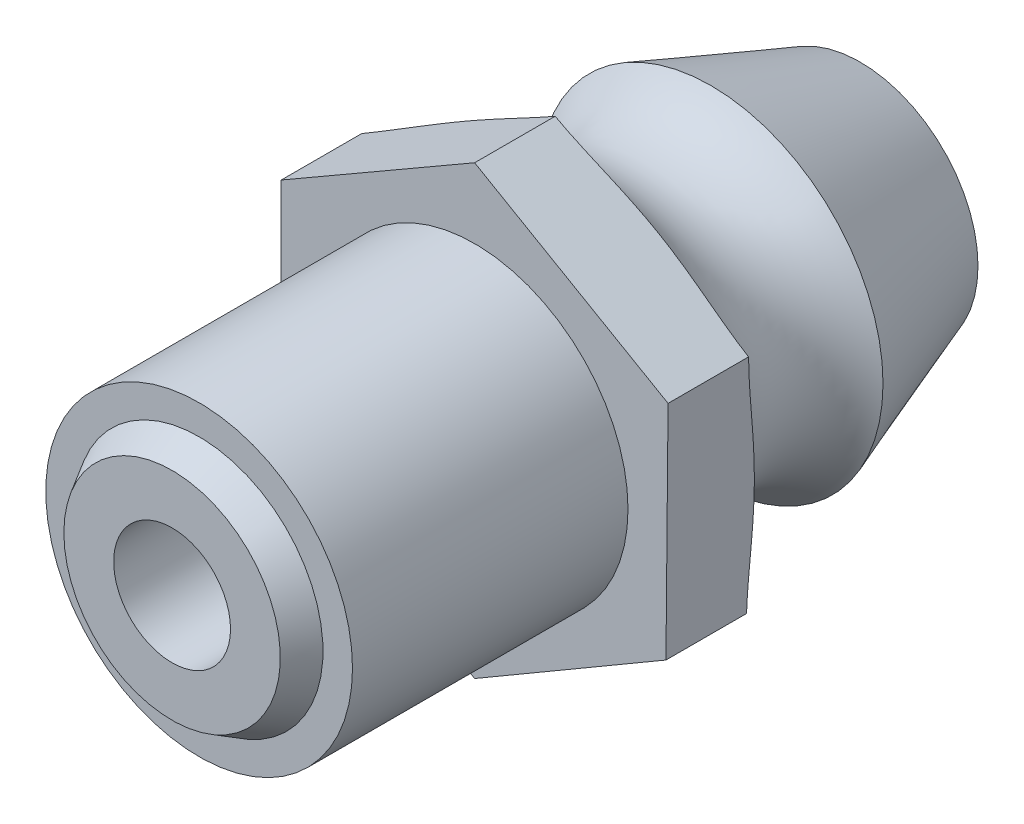
ISO-10303-21;
HEADER;
FILE_DESCRIPTION(('STEP AP214'),'2;1');
FILE_NAME('part.step','',(''),(''),'','','');
FILE_SCHEMA(('AUTOMOTIVE_DESIGN { 1 0 10303 214 1 1 1 1 }'));
ENDSEC;
DATA;
#1=APPLICATION_CONTEXT('core data for automotive mechanical design processes');
#2=APPLICATION_PROTOCOL_DEFINITION('international standard','automotive_design',2000,#1);
#3=PRODUCT_CONTEXT('',#1,'mechanical');
#4=PRODUCT('Part','Part','',(#3));
#5=PRODUCT_RELATED_PRODUCT_CATEGORY('part','',(#4));
#6=PRODUCT_DEFINITION_FORMATION('','',#4);
#7=PRODUCT_DEFINITION_CONTEXT('part definition',#1,'design');
#8=PRODUCT_DEFINITION('design','',#6,#7);
#9=PRODUCT_DEFINITION_SHAPE('','',#8);
#10=(LENGTH_UNIT() NAMED_UNIT(*) SI_UNIT(.MILLI.,.METRE.));
#11=(NAMED_UNIT(*) PLANE_ANGLE_UNIT() SI_UNIT($,.RADIAN.));
#12=(NAMED_UNIT(*) SI_UNIT($,.STERADIAN.) SOLID_ANGLE_UNIT());
#13=UNCERTAINTY_MEASURE_WITH_UNIT(LENGTH_MEASURE(1.E-05),#10,'distance_accuracy_value','');
#14=(GEOMETRIC_REPRESENTATION_CONTEXT(3) GLOBAL_UNCERTAINTY_ASSIGNED_CONTEXT((#13)) GLOBAL_UNIT_ASSIGNED_CONTEXT((#10,
#11,#12)) REPRESENTATION_CONTEXT('',''));
#15=CARTESIAN_POINT('',(0.,0.,0.));
#16=DIRECTION('',(0.,0.,1.));
#17=DIRECTION('',(1.,0.,0.));
#18=AXIS2_PLACEMENT_3D('',#15,#16,#17);
#19=CARTESIAN_POINT('',(-2.22044604925031E-13,0.761999999999485,-7.54380000000054));
#20=DIRECTION('',(0.,0.,1.));
#21=DIRECTION('',(1.,0.,0.));
#22=AXIS2_PLACEMENT_3D('',#19,#20,#21);
#23=PLANE('',#22);
#24=CARTESIAN_POINT('',(-2.22044604925031E-13,-6.66133814775094E-13,-7.54380000000032));
#25=DIRECTION('',(0.,0.,1.));
#26=DIRECTION('',(1.,0.,0.));
#27=AXIS2_PLACEMENT_3D('',#24,#25,#26);
#28=CIRCLE('',#27,0.762);
#29=CARTESIAN_POINT('',(0.761999999999779,-6.6621841376957E-13,-7.54380000000032));
#30=VERTEX_POINT('',#29);
#31=EDGE_CURVE('E20',#30,#30,#28,.T.);
#32=ORIENTED_EDGE('',*,*,#31,.T.);
#33=EDGE_LOOP('',(#32));
#34=FACE_BOUND('',#33,.T.);
#35=CARTESIAN_POINT('',(0.,-4.44089209850063E-13,-7.54380000006494));
#36=DIRECTION('',(0.,0.,1.));
#37=DIRECTION('',(1.,0.,0.));
#38=AXIS2_PLACEMENT_3D('',#35,#36,#37);
#39=CIRCLE('',#38,2.30234294568799);
#40=CARTESIAN_POINT('',(2.302342945688,-4.44344821264951E-13,-7.54380000006494));
#41=VERTEX_POINT('',#40);
#42=EDGE_CURVE('E264',#41,#41,#39,.T.);
#43=ORIENTED_EDGE('',*,*,#42,.F.);
#44=EDGE_LOOP('',(#43));
#45=FACE_BOUND('',#44,.T.);
#46=ADVANCED_FACE('F17',(#34,#45),#23,.F.);
#47=CARTESIAN_POINT('',(6.66133814775094E-13,-6.66133814775094E-13,82.9089130434784));
#48=DIRECTION('',(0.,0.,1.));
#49=DIRECTION('',(1.,0.,0.));
#50=AXIS2_PLACEMENT_3D('',#47,#48,#49);
#51=CYLINDRICAL_SURFACE('',#50,0.762);
#52=ORIENTED_EDGE('',*,*,#31,.F.);
#53=EDGE_LOOP('',(#52));
#54=FACE_BOUND('',#53,.T.);
#55=CARTESIAN_POINT('',(-2.22044604925031E-13,-4.44089209850063E-13,-4.62279999999982));
#56=DIRECTION('',(0.,0.,1.));
#57=DIRECTION('',(1.,0.,0.));
#58=AXIS2_PLACEMENT_3D('',#55,#56,#57);
#59=CIRCLE('',#58,0.762);
#60=CARTESIAN_POINT('',(0.761999999999779,-4.44173808844539E-13,-4.62279999999982));
#61=VERTEX_POINT('',#60);
#62=EDGE_CURVE('E244',#61,#61,#59,.T.);
#63=ORIENTED_EDGE('',*,*,#62,.T.);
#64=EDGE_LOOP('',(#63));
#65=FACE_BOUND('',#64,.T.);
#66=ADVANCED_FACE('F286',(#54,#65),#51,.F.);
#67=CARTESIAN_POINT('',(0.,-6.66133814775094E-13,-4.62280000027726));
#68=DIRECTION('',(0.,0.,1.));
#69=DIRECTION('',(1.,0.,0.));
#70=AXIS2_PLACEMENT_3D('',#67,#68,#69);
#71=CONICAL_SURFACE('',#70,3.36549999991576,0.349065850402961);
#72=CARTESIAN_POINT('',(-2.22044604925031E-13,-4.44089209850063E-13,-4.62279999999982));
#73=DIRECTION('',(0.,0.,1.));
#74=DIRECTION('',(1.,0.,0.));
#75=AXIS2_PLACEMENT_3D('',#72,#73,#74);
#76=CIRCLE('',#75,3.3655);
#77=CARTESIAN_POINT('',(3.36549999999978,-4.44462855409E-13,-4.62279999999982));
#78=VERTEX_POINT('',#77);
#79=EDGE_CURVE('E240',#78,#78,#76,.F.);
#80=ORIENTED_EDGE('',*,*,#79,.T.);
#81=EDGE_LOOP('',(#80));
#82=FACE_BOUND('',#81,.T.);
#83=ORIENTED_EDGE('',*,*,#42,.T.);
#84=EDGE_LOOP('',(#83));
#85=FACE_BOUND('',#84,.T.);
#86=ADVANCED_FACE('F279',(#82,#85),#71,.T.);
#87=CARTESIAN_POINT('',(0.,1.14299999999945,-4.62280000000004));
#88=DIRECTION('',(0.,0.,-1.));
#89=DIRECTION('',(-1.,0.,0.));
#90=AXIS2_PLACEMENT_3D('',#87,#88,#89);
#91=PLANE('',#90);
#92=CARTESIAN_POINT('',(-2.22044604925031E-13,-4.44089209850063E-13,-4.62279999999982));
#93=DIRECTION('',(0.,0.,1.));
#94=DIRECTION('',(1.,0.,0.));
#95=AXIS2_PLACEMENT_3D('',#92,#93,#94);
#96=CIRCLE('',#95,1.143);
#97=CARTESIAN_POINT('',(1.14299999999978,-4.44216108341777E-13,-4.62279999999982));
#98=VERTEX_POINT('',#97);
#99=EDGE_CURVE('E243',#98,#98,#96,.T.);
#100=ORIENTED_EDGE('',*,*,#99,.T.);
#101=EDGE_LOOP('',(#100));
#102=FACE_BOUND('',#101,.T.);
#103=ORIENTED_EDGE('',*,*,#62,.F.);
#104=EDGE_LOOP('',(#103));
#105=FACE_BOUND('',#104,.T.);
#106=ADVANCED_FACE('F274',(#102,#105),#91,.F.);
#107=CARTESIAN_POINT('',(6.66133814775094E-13,-6.66133814775094E-13,82.9089130434784));
#108=DIRECTION('',(0.,0.,1.));
#109=DIRECTION('',(1.,0.,0.));
#110=AXIS2_PLACEMENT_3D('',#107,#108,#109);
#111=CYLINDRICAL_SURFACE('',#110,1.143);
#112=ORIENTED_EDGE('',*,*,#99,.F.);
#113=EDGE_LOOP('',(#112));
#114=FACE_BOUND('',#113,.T.);
#115=CARTESIAN_POINT('',(0.,-6.66133814775094E-13,5.91819999999987));
#116=DIRECTION('',(0.,0.,1.));
#117=DIRECTION('',(1.,0.,0.));
#118=AXIS2_PLACEMENT_3D('',#115,#116,#117);
#119=CIRCLE('',#118,1.143);
#120=CARTESIAN_POINT('',(1.143,-6.66260713266809E-13,5.91819999999987));
#121=VERTEX_POINT('',#120);
#122=EDGE_CURVE('E88',#121,#121,#119,.T.);
#123=ORIENTED_EDGE('',*,*,#122,.T.);
#124=EDGE_LOOP('',(#123));
#125=FACE_BOUND('',#124,.T.);
#126=ADVANCED_FACE('F144',(#114,#125),#111,.F.);
#127=CARTESIAN_POINT('',(0.,-4.44089209850063E-13,-3.2831227626593));
#128=DIRECTION('',(0.,0.,1.));
#129=DIRECTION('',(1.,0.,0.));
#130=AXIS2_PLACEMENT_3D('',#127,#128,#129);
#131=TOROIDAL_SURFACE('',#130,4.42711788655914,1.70931788655949);
#132=ORIENTED_EDGE('',*,*,#79,.F.);
#133=EDGE_LOOP('',(#132));
#134=FACE_BOUND('',#133,.T.);
#135=CARTESIAN_POINT('',(-3.78349178405424,2.18439999999931,-1.57480000000021));
#136=CARTESIAN_POINT('',(-3.78349178405381,2.06276980868008,-1.57688125890901));
#137=CARTESIAN_POINT('',(-3.78349178405363,1.94128341823368,-1.58206926280949));
#138=CARTESIAN_POINT('',(-3.78349178405351,1.6983179305076,-1.59628516529951));
#139=CARTESIAN_POINT('',(-3.78349178405355,1.57683918904314,-1.60531950651798));
#140=CARTESIAN_POINT('',(-3.78349178405358,1.33388174470415,-1.62484232144777));
#141=CARTESIAN_POINT('',(-3.78349178405357,1.21240319320017,-1.63533240688329));
#142=CARTESIAN_POINT('',(-3.78349178405357,0.969773239378941,-1.65542037040784));
#143=CARTESIAN_POINT('',(-3.7834917840536,0.848622101471852,-1.66502111470588));
#144=CARTESIAN_POINT('',(-3.78349178405354,0.606246675666369,-1.68134109395584));
#145=CARTESIAN_POINT('',(-3.78349178405345,0.485022616364463,-1.68806349988645));
#146=CARTESIAN_POINT('',(-3.78349178405369,0.242532244243787,-1.69719553773035));
#147=CARTESIAN_POINT('',(-3.78349178405402,0.121266122121338,-1.6996098711788));
#148=CARTESIAN_POINT('',(-3.78349178405402,-0.121266122123511,-1.69960987117878));
#149=CARTESIAN_POINT('',(-3.78349178405369,-0.242532244245912,-1.69719553773031));
#150=CARTESIAN_POINT('',(-3.78349178405345,-0.485022616366491,-1.68806349988639));
#151=CARTESIAN_POINT('',(-3.78349178405354,-0.606246675668349,-1.68134109395577));
#152=CARTESIAN_POINT('',(-3.7834917840536,-0.848622101473736,-1.6650211147058));
#153=CARTESIAN_POINT('',(-3.78349178405357,-0.969773239380776,-1.65542037040776));
#154=CARTESIAN_POINT('',(-3.78349178405357,-1.21240319320191,-1.63533240688321));
#155=CARTESIAN_POINT('',(-3.78349178405359,-1.33388174470584,-1.62484232144769));
#156=CARTESIAN_POINT('',(-3.78349178405355,-1.57683918904474,-1.60531950651794));
#157=CARTESIAN_POINT('',(-3.78349178405349,-1.69831793050915,-1.59628516529951));
#158=CARTESIAN_POINT('',(-3.78349178405365,-1.94128341823513,-1.58206926280942));
#159=CARTESIAN_POINT('',(-3.78349178405389,-2.06276980868148,-1.57688125890883));
#160=CARTESIAN_POINT('',(-3.78349178405446,-2.18440000000064,-1.57479999999977));
#161=B_SPLINE_CURVE_WITH_KNOTS('',3,(#135,#136,#137,#138,#139,#140,#141,#142,#143,#144,#145,
#146,#147,#148,#149,#150,#151,#152,#153,#154,#155,#156,#157,#158,#159,#160),.UNSPECIFIED.,.F.,
.F.,(4,2,2,2,2,2,2,2,2,2,2,2,4),(0.,0.364780468233747,0.730174363950634,1.09597608109872,
1.46055457007221,1.82473037397849,2.18850849772427,2.5522866214699,2.91646242537604,
3.28104091434938,3.64684263149733,4.01223652721407,4.37701699544767),.UNSPECIFIED.);
#162=CARTESIAN_POINT('',(-3.78349178405424,2.18439999999931,-1.57480000000021));
#163=VERTEX_POINT('',#162);
#164=CARTESIAN_POINT('',(-3.78349178405446,-2.18440000000064,-1.57479999999977));
#165=VERTEX_POINT('',#164);
#166=EDGE_CURVE('E111',#163,#165,#161,.T.);
#167=ORIENTED_EDGE('',*,*,#166,.F.);
#168=CARTESIAN_POINT('',(0.,4.36879999999973,-1.5748000000001));
#169=CARTESIAN_POINT('',(-0.123752347896116,4.29735154862886,-1.57725077688538));
#170=CARTESIAN_POINT('',(-0.247304955786151,4.22601841720438,-1.58397951603197));
#171=CARTESIAN_POINT('',(-0.49418230153577,4.08348371517896,-1.60214517571036));
#172=CARTESIAN_POINT('',(-0.617507012986446,4.0122821598252,-1.61358261125892));
#173=CARTESIAN_POINT('',(-0.864061590214219,3.86993380829283,-1.63731458568631));
#174=CARTESIAN_POINT('',(-0.98729146381015,3.79878700760001,-1.64960904397984));
#175=CARTESIAN_POINT('',(-1.23385425262609,3.65643391510498,-1.67147514206419));
#176=CARTESIAN_POINT('',(-1.35718700279537,3.58522771859485,-1.68104898583648));
#177=CARTESIAN_POINT('',(-1.60404696973802,3.44270305022837,-1.69469703681413));
#178=CARTESIAN_POINT('',(-1.72757407192692,3.37138464452738,-1.6987737545548));
#179=CARTESIAN_POINT('',(-1.97453217945538,3.22880331466728,-1.70020887295763));
#180=CARTESIAN_POINT('',(-2.09796315068058,3.1575404102041,-1.69757427491741));
#181=CARTESIAN_POINT('',(-2.34462917738286,3.01512771328754,-1.68639530193651));
#182=CARTESIAN_POINT('',(-2.46786418514244,2.94397794838387,-1.6778496591257));
#183=CARTESIAN_POINT('',(-2.71412962988905,2.80179652756756,-1.65734428252846));
#184=CARTESIAN_POINT('',(-2.83716001040193,2.73076490426028,-1.64538372624909));
#185=CARTESIAN_POINT('',(-3.00585213020668,2.63337046348058,-1.62900404957492));
#186=CARTESIAN_POINT('',(-3.0515143011848,2.60700739677444,-1.62457234527281));
#187=CARTESIAN_POINT('',(-3.14284714084467,2.55427635721085,-1.61590687082782));
#188=CARTESIAN_POINT('',(-3.18851780768207,2.52790838541825,-1.61167307533908));
#189=CARTESIAN_POINT('',(-3.27987932248103,2.47516079025552,-1.60359558105454));
#190=CARTESIAN_POINT('',(-3.3255701669581,2.44878116889718,-1.59975183054054));
#191=CARTESIAN_POINT('',(-3.4170095714751,2.39598860408474,-1.59264788422354));
#192=CARTESIAN_POINT('',(-3.46275814900932,2.36957565053033,-1.58938798410813));
#193=CARTESIAN_POINT('',(-3.55430405523842,2.31672159692573,-1.58365067272662));
#194=CARTESIAN_POINT('',(-3.6001013928107,2.29028049175018,-1.58117344401526));
#195=CARTESIAN_POINT('',(-3.6917589440331,2.23736197987874,-1.57719989606266));
#196=CARTESIAN_POINT('',(-3.73761917926416,2.21088456072307,-1.57570425180655));
#197=CARTESIAN_POINT('',(-3.78349178405424,2.18439999999931,-1.57480000000021));
#198=B_SPLINE_CURVE_WITH_KNOTS('',3,(#168,#169,#170,#171,#172,#173,#174,#175,#176,#177,#178,
#179,#180,#181,#182,#183,#184,#185,#186,#187,#188,#189,#190,#191,#192,#193,#194,#195,#196,#197),
.UNSPECIFIED.,.F.,.F.,(4,2,2,2,2,2,2,2,2,2,2,2,2,2,4),(0.,0.428479409153256,0.857005695978519,
1.28549174295626,1.71362967550363,2.14157201132408,2.56906809718586,2.99665590586098,
3.42434678744249,3.58308321535909,3.74179925816365,3.9004942283673,4.0592693428312,
4.21808146361633,4.37700267722105),.UNSPECIFIED.);
#199=CARTESIAN_POINT('',(0.,4.36879999999973,-1.5748000000001));
#200=VERTEX_POINT('',#199);
#201=EDGE_CURVE('E73',#200,#163,#198,.T.);
#202=ORIENTED_EDGE('',*,*,#201,.F.);
#203=CARTESIAN_POINT('',(3.78349178405357,2.18439999999975,-1.57480000000021));
#204=CARTESIAN_POINT('',(3.6597394361571,2.25584845136998,-1.57725077688545));
#205=CARTESIAN_POINT('',(3.53618682826693,2.32718158279418,-1.58397951603203));
#206=CARTESIAN_POINT('',(3.28930948251723,2.46971628481939,-1.60214517571044));
#207=CARTESIAN_POINT('',(3.16598477106662,2.54091784017321,-1.61358261125902));
#208=CARTESIAN_POINT('',(2.91943019383893,2.6832661917056,-1.63731458568645));
#209=CARTESIAN_POINT('',(2.79620032024301,2.75441299239839,-1.64960904397999));
#210=CARTESIAN_POINT('',(2.54963753142712,2.89676608489337,-1.67147514206435));
#211=CARTESIAN_POINT('',(2.42630478125787,2.96797228140349,-1.68104898583666));
#212=CARTESIAN_POINT('',(2.17944481431528,3.11049694976994,-1.69469703681433));
#213=CARTESIAN_POINT('',(2.05591771212639,3.1818153554709,-1.69877375455502));
#214=CARTESIAN_POINT('',(1.80895960459799,3.324396685331,-1.70020887295784));
#215=CARTESIAN_POINT('',(1.68552863337284,3.3956595897942,-1.6975742749176));
#216=CARTESIAN_POINT('',(1.43886260667053,3.53807228671064,-1.68639530193677));
#217=CARTESIAN_POINT('',(1.31562759891089,3.60922205161415,-1.67784965912606));
#218=CARTESIAN_POINT('',(1.06936215416457,3.75140347243082,-1.65734428252853));
#219=CARTESIAN_POINT('',(0.946331773652035,3.82243509573862,-1.64538372624878));
#220=CARTESIAN_POINT('',(0.777639653847055,3.9198295365179,-1.62900404957488));
#221=CARTESIAN_POINT('',(0.731977482868794,3.94619260322381,-1.62457234527293));
#222=CARTESIAN_POINT('',(0.640644643208838,3.99892364278722,-1.61590687082803));
#223=CARTESIAN_POINT('',(0.594973976371487,4.02529161457988,-1.61167307533925));
#224=CARTESIAN_POINT('',(0.503612461572566,4.07803920974264,-1.60359558105466));
#225=CARTESIAN_POINT('',(0.457921617095495,4.10441883110096,-1.59975183054067));
#226=CARTESIAN_POINT('',(0.366482212578513,4.15721139591338,-1.59264788422365));
#227=CARTESIAN_POINT('',(0.320733635044311,4.18362434946782,-1.58938798410823));
#228=CARTESIAN_POINT('',(0.229187728815198,4.23647840307236,-1.5836506727267));
#229=CARTESIAN_POINT('',(0.183390391242888,4.26291950824783,-1.58117344401535));
#230=CARTESIAN_POINT('',(0.0917328400206173,4.31583802011945,-1.5771998960627));
#231=CARTESIAN_POINT('',(0.0458726047897118,4.34231543927536,-1.57570425180654));
#232=CARTESIAN_POINT('',(0.,4.36879999999973,-1.5748000000001));
#233=B_SPLINE_CURVE_WITH_KNOTS('',3,(#203,#204,#205,#206,#207,#208,#209,#210,#211,#212,#213,
#214,#215,#216,#217,#218,#219,#220,#221,#222,#223,#224,#225,#226,#227,#228,#229,#230,#231,#232),
.UNSPECIFIED.,.F.,.F.,(4,2,2,2,2,2,2,2,2,2,2,2,2,2,4),(0.,0.428479409153208,0.857005695978398,
1.28549174295605,1.71362967550332,2.1415720113237,2.56906809718539,2.99665590586044,
3.42434678744189,3.58308321535846,3.74179925816299,3.90049422836661,4.05926934283048,
4.21808146361559,4.37700267722028),.UNSPECIFIED.);
#234=CARTESIAN_POINT('',(3.78349178405357,2.18439999999975,-1.57480000000021));
#235=VERTEX_POINT('',#234);
#236=EDGE_CURVE('E67',#235,#200,#233,.T.);
#237=ORIENTED_EDGE('',*,*,#236,.F.);
#238=CARTESIAN_POINT('',(3.74240270414194,-2.18440000000064,-1.57638342051469));
#239=CARTESIAN_POINT('',(3.74354645313817,-2.06279078836953,-1.57970331794403));
#240=CARTESIAN_POINT('',(3.74468863033256,-1.94134869870483,-1.58600559405204));
#241=CARTESIAN_POINT('',(3.74697325474004,-1.6984358096142,-1.60218610653842));
#242=CARTESIAN_POINT('',(3.74811569751401,-1.5769654821777,-1.61207180041354));
#243=CARTESIAN_POINT('',(3.75040089079668,-1.3339921073831,-1.63300915513309));
#244=CARTESIAN_POINT('',(3.75154363995744,-1.21248920334443,-1.64406223427014));
#245=CARTESIAN_POINT('',(3.75382586853809,-0.96983105075062,-1.66495027275862));
#246=CARTESIAN_POINT('',(3.754965344004,-0.848676222603108,-1.67478967561624));
#247=CARTESIAN_POINT('',(3.75724507598229,-0.606283521469596,-1.69126125258367));
#248=CARTESIAN_POINT('',(3.75838532981146,-0.485045933776758,-1.69789735546977));
#249=CARTESIAN_POINT('',(3.76066618064789,-0.242534269964681,-1.7065601202849));
#250=CARTESIAN_POINT('',(3.76180677569517,-0.121260402241391,-1.70859216247797));
#251=CARTESIAN_POINT('',(3.76380249642776,0.0909347784596376,-1.70775964576899));
#252=CARTESIAN_POINT('',(3.76465767753656,0.181861984338546,-1.70599257125287));
#253=CARTESIAN_POINT('',(3.76636786721621,0.363698050973542,-1.69986970013498));
#254=CARTESIAN_POINT('',(3.76722287512169,0.454606840982887,-1.69551186743732));
#255=CARTESIAN_POINT('',(3.7689325416128,0.63638727954042,-1.68472323819781));
#256=CARTESIAN_POINT('',(3.7697871989959,0.727258800230474,-1.6782903748618));
#257=CARTESIAN_POINT('',(3.77149616145524,0.908964382552051,-1.66410816882419));
#258=CARTESIAN_POINT('',(3.77235046577025,0.999798363246181,-1.65635782945442));
#259=CARTESIAN_POINT('',(3.77406191787173,1.18176865698369,-1.64041810922557));
#260=CARTESIAN_POINT('',(3.77491906435374,1.27290483133203,-1.63222719590413));
#261=CARTESIAN_POINT('',(3.77663326552541,1.45516742019787,-1.61642672139611));
#262=CARTESIAN_POINT('',(3.77749031989535,1.54629380072166,-1.60881677630583));
#263=CARTESIAN_POINT('',(3.77920458491711,1.728563178454,-1.59519703855517));
#264=CARTESIAN_POINT('',(3.78006179407866,1.81970601720877,-1.58918528823436));
#265=CARTESIAN_POINT('',(3.78177639259725,2.00201085402009,-1.57977996853251));
#266=CARTESIAN_POINT('',(3.7826337804722,2.09317269449074,-1.57638322953374));
#267=CARTESIAN_POINT('',(3.78349178405357,2.18439999999975,-1.57480000000021));
#268=B_SPLINE_CURVE_WITH_KNOTS('',3,(#238,#239,#240,#241,#242,#243,#244,#245,#246,#247,#248,
#249,#250,#251,#252,#253,#254,#255,#256,#257,#258,#259,#260,#261,#262,#263,#264,#265,#266,#267),
.UNSPECIFIED.,.F.,.F.,(4,2,2,2,2,2,2,2,2,2,2,2,2,2,4),(0.,0.364826693627981,0.73041703324501,
1.09645676375648,1.46111384994031,1.82532254871063,2.1891054164608,2.46191099746622,
2.73493126233631,3.00822430783305,3.28172502665408,3.55624781703032,3.83058760375013,
4.10458978148127,4.3782593199187),.UNSPECIFIED.);
#269=CARTESIAN_POINT('',(3.74240270414194,-2.18440000000064,-1.57638342051469));
#270=VERTEX_POINT('',#269);
#271=EDGE_CURVE('E70',#270,#235,#268,.T.);
#272=ORIENTED_EDGE('',*,*,#271,.F.);
#273=CARTESIAN_POINT('',(-4.44089209850063E-13,-4.36880000000017,-1.57479999999999));
#274=CARTESIAN_POINT('',(0.123417468673395,-4.29676255777824,-1.57726835311565));
#275=CARTESIAN_POINT('',(0.246629659729055,-4.22484493388277,-1.58409426197097));
#276=CARTESIAN_POINT('',(0.4928394938701,-4.08113491542261,-1.60259074402161));
#277=CARTESIAN_POINT('',(0.615837059526094,-4.00934256605261,-1.61426280306047));
#278=CARTESIAN_POINT('',(0.861745273545202,-3.86580859999683,-1.63857557766213));
#279=CARTESIAN_POINT('',(0.98465591642511,-3.79406698651154,-1.6512163496376));
#280=CARTESIAN_POINT('',(1.23058840107153,-3.65051885395299,-1.67382699913756));
#281=CARTESIAN_POINT('',(1.35361008552515,-3.57871242670156,-1.68379891529173));
#282=CARTESIAN_POINT('',(1.59980854771262,-3.43500904592773,-1.69820146415221));
#283=CARTESIAN_POINT('',(1.72298508704267,-3.36311223155905,-1.7026370637859));
#284=CARTESIAN_POINT('',(1.96924324446533,-3.2193740073218,-1.70465631555817));
#285=CARTESIAN_POINT('',(2.09232480893322,-3.1475326287534,-1.70224783732578));
#286=CARTESIAN_POINT('',(2.33828331264522,-3.00396930914755,-1.69131878846096));
#287=CARTESIAN_POINT('',(2.46116021632643,-2.93224738886776,-1.68279724817673));
#288=CARTESIAN_POINT('',(2.70669125642886,-2.78893357514966,-1.66211645478988));
#289=CARTESIAN_POINT('',(2.82934533507177,-2.7173417154359,-1.64995636492244));
#290=CARTESIAN_POINT('',(2.9958304524783,-2.62016615224476,-1.63332432003658));
#291=CARTESIAN_POINT('',(3.03966942861836,-2.59457781580665,-1.62893285163485));
#292=CARTESIAN_POINT('',(3.12735439527872,-2.54339704871256,-1.62030045095631));
#293=CARTESIAN_POINT('',(3.17120038469094,-2.51780461870336,-1.61605950397254));
#294=CARTESIAN_POINT('',(3.25891045273188,-2.46660920020482,-1.60790037643188));
#295=CARTESIAN_POINT('',(3.30277452899252,-2.44100621309771,-1.60398216220466));
#296=CARTESIAN_POINT('',(3.39056149209953,-2.3897659117804,-1.59664128456832));
#297=CARTESIAN_POINT('',(3.43448439856047,-2.36412858612139,-1.5932189314677));
#298=CARTESIAN_POINT('',(3.52237499776052,-2.31282779353693,-1.58704878370309));
#299=CARTESIAN_POINT('',(3.56634269746487,-2.28716432254596,-1.58430111832808));
#300=CARTESIAN_POINT('',(3.65433616086609,-2.23580348923944,-1.57965772556416));
#301=CARTESIAN_POINT('',(3.69836194334439,-2.21010611596139,-1.57776248151272));
#302=CARTESIAN_POINT('',(3.74240270414172,-2.18440000000064,-1.57638342051492));
#303=B_SPLINE_CURVE_WITH_KNOTS('',3,(#273,#274,#275,#276,#277,#278,#279,#280,#281,#282,#283,
#284,#285,#286,#287,#288,#289,#290,#291,#292,#293,#294,#295,#296,#297,#298,#299,#300,#301,#302),
.UNSPECIFIED.,.F.,.F.,(4,2,2,2,2,2,2,2,2,2,2,2,2,2,4),(0.,0.428488853237922,0.857109179517122,
1.28575448535065,1.71407142599353,2.14200382361744,2.56944436446754,2.99695272078542,
3.4245594677488,3.57740990984222,3.73024537605684,3.8830648768776,4.03597960243841,
4.18892360789408,4.34195422622599),.UNSPECIFIED.);
#304=CARTESIAN_POINT('',(-4.44089209850063E-13,-4.36880000000017,-1.57479999999999));
#305=VERTEX_POINT('',#304);
#306=EDGE_CURVE('E87',#305,#270,#303,.T.);
#307=ORIENTED_EDGE('',*,*,#306,.F.);
#308=CARTESIAN_POINT('',(-3.78349178405446,-2.18440000000064,-1.57479999999977));
#309=CARTESIAN_POINT('',(-3.65973943615809,-2.25584845137105,-1.57725077688523));
#310=CARTESIAN_POINT('',(-3.53618682826795,-2.32718158279533,-1.58397951603188));
#311=CARTESIAN_POINT('',(-3.28930948251826,-2.46971628482061,-1.6021451757103));
#312=CARTESIAN_POINT('',(-3.16598477106761,-2.54091784017442,-1.61358261125882));
#313=CARTESIAN_POINT('',(-2.91943019383985,-2.68326619170684,-1.63731458568618));
#314=CARTESIAN_POINT('',(-2.7962003202439,-2.75441299239965,-1.64960904397971));
#315=CARTESIAN_POINT('',(-2.54963753142795,-2.89676608489467,-1.67147514206406));
#316=CARTESIAN_POINT('',(-2.42630478125865,-2.96797228140481,-1.68104898583636));
#317=CARTESIAN_POINT('',(-2.179444814316,-3.1104969497713,-1.69469703681401));
#318=CARTESIAN_POINT('',(-2.0559177121271,-3.18181535547228,-1.69877375455468));
#319=CARTESIAN_POINT('',(-1.80895960459863,-3.32439668533239,-1.70020887295755));
#320=CARTESIAN_POINT('',(-1.68552863337344,-3.39565958979557,-1.69757427491736));
#321=CARTESIAN_POINT('',(-1.43886260667115,-3.53807228671213,-1.68639530193642));
#322=CARTESIAN_POINT('',(-1.31562759891157,-3.60922205161579,-1.67784965912555));
#323=CARTESIAN_POINT('',(-1.06936215416496,-3.75140347243213,-1.65734428252854));
#324=CARTESIAN_POINT('',(-0.946331773652077,-3.82243509573945,-1.64538372624947));
#325=CARTESIAN_POINT('',(-0.777639653847372,-3.91982953651909,-1.62900404957509));
#326=CARTESIAN_POINT('',(-0.73197748286928,-3.9461926032252,-1.62457234527286));
#327=CARTESIAN_POINT('',(-0.640644643209477,-3.99892364278873,-1.61590687082779));
#328=CARTESIAN_POINT('',(-0.59497397637211,-4.02529161458132,-1.61167307533909));
#329=CARTESIAN_POINT('',(-0.50361246157321,-4.07803920974402,-1.60359558105458));
#330=CARTESIAN_POINT('',(-0.457921617096175,-4.10441883110234,-1.59975183054057));
#331=CARTESIAN_POINT('',(-0.366482212579243,-4.15721139591474,-1.59264788422357));
#332=CARTESIAN_POINT('',(-0.320733635045054,-4.18362434946914,-1.58938798410816));
#333=CARTESIAN_POINT('',(-0.229187728816012,-4.23647840307369,-1.58365067272665));
#334=CARTESIAN_POINT('',(-0.18339039124376,-4.26291950824921,-1.58117344401528));
#335=CARTESIAN_POINT('',(-0.0917328400214453,-4.31583802012065,-1.57719989606269));
#336=CARTESIAN_POINT('',(-0.0458726047904379,-4.34231543927633,-1.5757042518066));
#337=CARTESIAN_POINT('',(-4.44089209850063E-13,-4.36880000000017,-1.57480000000032));
#338=B_SPLINE_CURVE_WITH_KNOTS('',3,(#308,#309,#310,#311,#312,#313,#314,#315,#316,#317,#318,
#319,#320,#321,#322,#323,#324,#325,#326,#327,#328,#329,#330,#331,#332,#333,#334,#335,#336,#337),
.UNSPECIFIED.,.F.,.F.,(4,2,2,2,2,2,2,2,2,2,2,2,2,2,4),(0.,0.428479409153237,0.857005695978506,
1.28549174295626,1.71362967550366,2.14157201132413,2.56906809718591,2.99665590586103,
3.42434678744253,3.58308321535901,3.74179925816346,3.900494228367,4.05926934283078,
4.21808146361581,4.37700267722042),.UNSPECIFIED.);
#339=EDGE_CURVE('E117',#165,#305,#338,.T.);
#340=ORIENTED_EDGE('',*,*,#339,.F.);
#341=EDGE_LOOP('',(#167,#202,#237,#272,#307,#340));
#342=FACE_BOUND('',#341,.T.);
#343=ADVANCED_FACE('F69',(#134,#342),#131,.F.);
#344=CARTESIAN_POINT('',(0.,1.14299999999967,5.91819999999976));
#345=DIRECTION('',(0.,0.,-1.));
#346=DIRECTION('',(-1.,0.,0.));
#347=AXIS2_PLACEMENT_3D('',#344,#345,#346);
#348=PLANE('',#347);
#349=CARTESIAN_POINT('',(-2.22044604925031E-13,-6.66133814775094E-13,5.91819999999632));
#350=DIRECTION('',(0.,0.,-1.));
#351=DIRECTION('',(-1.,0.,0.));
#352=AXIS2_PLACEMENT_3D('',#349,#350,#351);
#353=CIRCLE('',#352,2.11727983010572);
#354=CARTESIAN_POINT('',(-2.11727983010595,-6.65898749493398E-13,5.91819999999632));
#355=VERTEX_POINT('',#354);
#356=EDGE_CURVE('E94',#355,#355,#353,.T.);
#357=ORIENTED_EDGE('',*,*,#356,.F.);
#358=EDGE_LOOP('',(#357));
#359=FACE_BOUND('',#358,.T.);
#360=ORIENTED_EDGE('',*,*,#122,.F.);
#361=EDGE_LOOP('',(#360));
#362=FACE_BOUND('',#361,.T.);
#363=ADVANCED_FACE('F143',(#359,#362),#348,.F.);
#364=CARTESIAN_POINT('',(3.74240270414194,-2.18440000000064,-7.54379999999999));
#365=DIRECTION('',(0.999955774810832,-0.00940470214686834,0.));
#366=DIRECTION('',(0.00940470214686806,0.999955774810831,0.));
#367=AXIS2_PLACEMENT_3D('',#364,#365,#366);
#368=PLANE('',#367);
#369=DIRECTION('',(-0.00940470214686806,-0.999955774810831,0.));
#370=VECTOR('',#369,1.);
#371=CARTESIAN_POINT('',(3.78349178405291,2.18439999999931,-2.22044604925031E-13));
#372=LINE('',#371,#370);
#373=CARTESIAN_POINT('',(3.78349178405291,2.18439999999931,-2.22044604925031E-13));
#374=VERTEX_POINT('',#373);
#375=CARTESIAN_POINT('',(3.74240270414194,-2.18440000000064,-2.22044604925031E-13));
#376=VERTEX_POINT('',#375);
#377=EDGE_CURVE('E97',#374,#376,#372,.T.);
#378=ORIENTED_EDGE('',*,*,#377,.T.);
#379=DIRECTION('',(0.,0.,1.));
#380=VECTOR('',#379,1.);
#381=CARTESIAN_POINT('',(3.74240270414194,-2.18440000000064,-7.54379999999999));
#382=LINE('',#381,#380);
#383=EDGE_CURVE('E85',#270,#376,#382,.T.);
#384=ORIENTED_EDGE('',*,*,#383,.F.);
#385=ORIENTED_EDGE('',*,*,#271,.T.);
#386=DIRECTION('',(0.,0.,1.));
#387=VECTOR('',#386,1.);
#388=CARTESIAN_POINT('',(3.78349178405335,2.18439999999887,-7.54380000000032));
#389=LINE('',#388,#387);
#390=EDGE_CURVE('E82',#374,#235,#389,.F.);
#391=ORIENTED_EDGE('',*,*,#390,.F.);
#392=EDGE_LOOP('',(#378,#384,#385,#391));
#393=FACE_BOUND('',#392,.T.);
#394=ADVANCED_FACE('F81',(#393),#368,.T.);
#395=CARTESIAN_POINT('',(-2.22044604925031E-13,-4.36880000000017,-7.54380000000032));
#396=DIRECTION('',(0.504100313346529,-0.863645108875128,0.));
#397=DIRECTION('',(0.863645108875129,0.504100313346529,0.));
#398=AXIS2_PLACEMENT_3D('',#395,#396,#397);
#399=PLANE('',#398);
#400=DIRECTION('',(-0.863645108875129,-0.504100313346529,0.));
#401=VECTOR('',#400,1.);
#402=CARTESIAN_POINT('',(3.74240270414194,-2.18440000000064,-2.22044604925031E-13));
#403=LINE('',#402,#401);
#404=CARTESIAN_POINT('',(-2.22044604925031E-13,-4.36880000000017,-1.11022302462516E-13));
#405=VERTEX_POINT('',#404);
#406=EDGE_CURVE('E128',#376,#405,#403,.T.);
#407=ORIENTED_EDGE('',*,*,#406,.T.);
#408=DIRECTION('',(0.,0.,1.));
#409=VECTOR('',#408,1.);
#410=CARTESIAN_POINT('',(-2.22044604925031E-13,-4.36880000000017,-7.54380000000032));
#411=LINE('',#410,#409);
#412=EDGE_CURVE('E114',#305,#405,#411,.T.);
#413=ORIENTED_EDGE('',*,*,#412,.F.);
#414=ORIENTED_EDGE('',*,*,#306,.T.);
#415=ORIENTED_EDGE('',*,*,#383,.T.);
#416=EDGE_LOOP('',(#407,#413,#414,#415));
#417=FACE_BOUND('',#416,.T.);
#418=ADVANCED_FACE('F203',(#417),#399,.T.);
#419=CARTESIAN_POINT('',(-3.78349178405335,-2.18440000000064,-7.54380000000021));
#420=DIRECTION('',(-0.499999999999999,-0.86602540378444,0.));
#421=DIRECTION('',(0.866025403784441,-0.499999999999998,0.));
#422=AXIS2_PLACEMENT_3D('',#419,#420,#421);
#423=PLANE('',#422);
#424=DIRECTION('',(-0.866025403784441,0.499999999999998,0.));
#425=VECTOR('',#424,1.);
#426=CARTESIAN_POINT('',(-2.22044604925031E-13,-4.36880000000017,-1.11022302462516E-13));
#427=LINE('',#426,#425);
#428=CARTESIAN_POINT('',(-3.78349178405335,-2.18440000000064,-2.22044604925031E-13));
#429=VERTEX_POINT('',#428);
#430=EDGE_CURVE('E248',#405,#429,#427,.T.);
#431=ORIENTED_EDGE('',*,*,#430,.T.);
#432=DIRECTION('',(0.,0.,1.));
#433=VECTOR('',#432,1.);
#434=CARTESIAN_POINT('',(-3.78349178405335,-2.18440000000064,-7.54380000000021));
#435=LINE('',#434,#433);
#436=EDGE_CURVE('E108',#165,#429,#435,.T.);
#437=ORIENTED_EDGE('',*,*,#436,.F.);
#438=ORIENTED_EDGE('',*,*,#339,.T.);
#439=ORIENTED_EDGE('',*,*,#412,.T.);
#440=EDGE_LOOP('',(#431,#437,#438,#439));
#441=FACE_BOUND('',#440,.T.);
#442=ADVANCED_FACE('F199',(#441),#423,.T.);
#443=CARTESIAN_POINT('',(-3.78349178405357,2.18439999999931,-7.5438000000001));
#444=DIRECTION('',(-1.,0.,0.));
#445=DIRECTION('',(0.,0.,1.));
#446=AXIS2_PLACEMENT_3D('',#443,#444,#445);
#447=PLANE('',#446);
#448=DIRECTION('',(0.,1.,0.));
#449=VECTOR('',#448,1.);
#450=CARTESIAN_POINT('',(-3.78349178405402,2.99999999999856,0.));
#451=LINE('',#450,#449);
#452=CARTESIAN_POINT('',(-3.78349178405424,2.18439999999931,0.));
#453=VERTEX_POINT('',#452);
#454=EDGE_CURVE('E132',#429,#453,#451,.T.);
#455=ORIENTED_EDGE('',*,*,#454,.T.);
#456=DIRECTION('',(0.,0.,1.));
#457=VECTOR('',#456,1.);
#458=CARTESIAN_POINT('',(-3.78349178405357,2.18439999999931,-7.5438000000001));
#459=LINE('',#458,#457);
#460=EDGE_CURVE('E77',#163,#453,#459,.T.);
#461=ORIENTED_EDGE('',*,*,#460,.F.);
#462=ORIENTED_EDGE('',*,*,#166,.T.);
#463=ORIENTED_EDGE('',*,*,#436,.T.);
#464=EDGE_LOOP('',(#455,#461,#462,#463));
#465=FACE_BOUND('',#464,.T.);
#466=ADVANCED_FACE('F196',(#465),#447,.T.);
#467=CARTESIAN_POINT('',(-2.22044604925031E-13,4.36879999999928,-7.5438000000001));
#468=DIRECTION('',(-0.499999999999999,0.86602540378444,0.));
#469=DIRECTION('',(-0.866025403784441,-0.499999999999998,0.));
#470=AXIS2_PLACEMENT_3D('',#467,#468,#469);
#471=PLANE('',#470);
#472=DIRECTION('',(0.866025403784441,0.499999999999998,0.));
#473=VECTOR('',#472,1.);
#474=CARTESIAN_POINT('',(-3.78349178405424,2.18439999999931,0.));
#475=LINE('',#474,#473);
#476=CARTESIAN_POINT('',(0.,4.36879999999884,-2.22044604925031E-13));
#477=VERTEX_POINT('',#476);
#478=EDGE_CURVE('E35',#453,#477,#475,.T.);
#479=ORIENTED_EDGE('',*,*,#478,.T.);
#480=DIRECTION('',(0.,0.,1.));
#481=VECTOR('',#480,1.);
#482=CARTESIAN_POINT('',(-2.22044604925031E-13,4.36879999999928,-7.5438000000001));
#483=LINE('',#482,#481);
#484=EDGE_CURVE('E76',#200,#477,#483,.T.);
#485=ORIENTED_EDGE('',*,*,#484,.F.);
#486=ORIENTED_EDGE('',*,*,#201,.T.);
#487=ORIENTED_EDGE('',*,*,#460,.T.);
#488=EDGE_LOOP('',(#479,#485,#486,#487));
#489=FACE_BOUND('',#488,.T.);
#490=ADVANCED_FACE('F192',(#489),#471,.T.);
#491=CARTESIAN_POINT('',(3.78349178405335,2.18439999999887,-7.54380000000032));
#492=DIRECTION('',(0.499999999999998,0.86602540378444,0.));
#493=DIRECTION('',(-0.866025403784441,0.499999999999998,0.));
#494=AXIS2_PLACEMENT_3D('',#491,#492,#493);
#495=PLANE('',#494);
#496=DIRECTION('',(0.866025403784441,-0.499999999999998,0.));
#497=VECTOR('',#496,1.);
#498=CARTESIAN_POINT('',(0.,4.36879999999884,-2.22044604925031E-13));
#499=LINE('',#498,#497);
#500=EDGE_CURVE('E92',#477,#374,#499,.T.);
#501=ORIENTED_EDGE('',*,*,#500,.T.);
#502=ORIENTED_EDGE('',*,*,#390,.T.);
#503=ORIENTED_EDGE('',*,*,#236,.T.);
#504=ORIENTED_EDGE('',*,*,#484,.T.);
#505=EDGE_LOOP('',(#501,#502,#503,#504));
#506=FACE_BOUND('',#505,.T.);
#507=ADVANCED_FACE('F90',(#506),#495,.T.);
#508=CARTESIAN_POINT('',(-2.22044604925031E-13,-4.44089209850063E-13,5.38903333358542));
#509=DIRECTION('',(0.,0.,-1.));
#510=DIRECTION('',(-1.,0.,0.));
#511=AXIS2_PLACEMENT_3D('',#508,#509,#510);
#512=CONICAL_SURFACE('',#511,2.42279434741022,0.523598775606964);
#513=ORIENTED_EDGE('',*,*,#356,.T.);
#514=EDGE_LOOP('',(#513));
#515=FACE_BOUND('',#514,.T.);
#516=CARTESIAN_POINT('',(-2.22044604925031E-13,-6.66133814775094E-13,5.38903333335816));
#517=DIRECTION('',(0.,0.,-1.));
#518=DIRECTION('',(-1.,0.,0.));
#519=AXIS2_PLACEMENT_3D('',#516,#517,#518);
#520=CIRCLE('',#519,2.42279434754149);
#521=CARTESIAN_POINT('',(-2.42279434754172,-6.65864830568237E-13,5.38903333335816));
#522=VERTEX_POINT('',#521);
#523=EDGE_CURVE('E124',#522,#522,#520,.F.);
#524=ORIENTED_EDGE('',*,*,#523,.T.);
#525=EDGE_LOOP('',(#524));
#526=FACE_BOUND('',#525,.T.);
#527=ADVANCED_FACE('F191',(#515,#526),#512,.T.);
#528=CARTESIAN_POINT('',(2.22044604925031E-13,2.99999999999945,2.22044604925031E-13));
#529=DIRECTION('',(0.,0.,-1.));
#530=DIRECTION('',(-1.,0.,0.));
#531=AXIS2_PLACEMENT_3D('',#528,#529,#530);
#532=PLANE('',#531);
#533=ORIENTED_EDGE('',*,*,#478,.F.);
#534=ORIENTED_EDGE('',*,*,#454,.F.);
#535=ORIENTED_EDGE('',*,*,#430,.F.);
#536=ORIENTED_EDGE('',*,*,#406,.F.);
#537=ORIENTED_EDGE('',*,*,#377,.F.);
#538=ORIENTED_EDGE('',*,*,#500,.F.);
#539=EDGE_LOOP('',(#533,#534,#535,#536,#537,#538));
#540=FACE_BOUND('',#539,.T.);
#541=CARTESIAN_POINT('',(0.,0.,0.));
#542=DIRECTION('',(0.,0.,1.));
#543=DIRECTION('',(1.,0.,0.));
#544=AXIS2_PLACEMENT_3D('',#541,#542,#543);
#545=CIRCLE('',#544,3.);
#546=CARTESIAN_POINT('',(3.00000000000001,0.,0.));
#547=VERTEX_POINT('',#546);
#548=EDGE_CURVE('E26',#547,#547,#545,.T.);
#549=ORIENTED_EDGE('',*,*,#548,.F.);
#550=EDGE_LOOP('',(#549));
#551=FACE_BOUND('',#550,.T.);
#552=ADVANCED_FACE('F223',(#540,#551),#532,.F.);
#553=CARTESIAN_POINT('',(-6.66133814775094E-13,2.42279434751524,5.38903333333329));
#554=DIRECTION('',(0.,0.,-1.));
#555=DIRECTION('',(-1.,0.,0.));
#556=AXIS2_PLACEMENT_3D('',#553,#554,#555);
#557=PLANE('',#556);
#558=CARTESIAN_POINT('',(-2.22044604925031E-13,-6.66133814775094E-13,5.38903333333307));
#559=DIRECTION('',(0.,0.,1.));
#560=DIRECTION('',(1.,0.,0.));
#561=AXIS2_PLACEMENT_3D('',#558,#559,#560);
#562=CIRCLE('',#561,3.);
#563=CARTESIAN_POINT('',(2.99999999999978,-6.66466881682481E-13,5.38903333333307));
#564=VERTEX_POINT('',#563);
#565=EDGE_CURVE('E11',#564,#564,#562,.F.);
#566=ORIENTED_EDGE('',*,*,#565,.F.);
#567=EDGE_LOOP('',(#566));
#568=FACE_BOUND('',#567,.T.);
#569=ORIENTED_EDGE('',*,*,#523,.F.);
#570=EDGE_LOOP('',(#569));
#571=FACE_BOUND('',#570,.T.);
#572=ADVANCED_FACE('F217',(#568,#571),#557,.F.);
#573=CARTESIAN_POINT('',(6.66133814775094E-13,-6.66133814775094E-13,82.9089130434784));
#574=DIRECTION('',(0.,0.,1.));
#575=DIRECTION('',(1.,0.,0.));
#576=AXIS2_PLACEMENT_3D('',#573,#574,#575);
#577=CYLINDRICAL_SURFACE('',#576,3.);
#578=ORIENTED_EDGE('',*,*,#565,.T.);
#579=EDGE_LOOP('',(#578));
#580=FACE_BOUND('',#579,.T.);
#581=ORIENTED_EDGE('',*,*,#548,.T.);
#582=EDGE_LOOP('',(#581));
#583=FACE_BOUND('',#582,.T.);
#584=ADVANCED_FACE('F215',(#580,#583),#577,.T.);
#585=CLOSED_SHELL('',(#46,#66,#86,#106,#126,#343,#363,#394,#418,#442,#466,#490,#507,#527,#552,
#572,#584));
#586=MANIFOLD_SOLID_BREP('B1',#585);
#587=ADVANCED_BREP_SHAPE_REPRESENTATION('',(#18,#586),#14);
#588=SHAPE_DEFINITION_REPRESENTATION(#9,#587);
ENDSEC;
END-ISO-10303-21;
